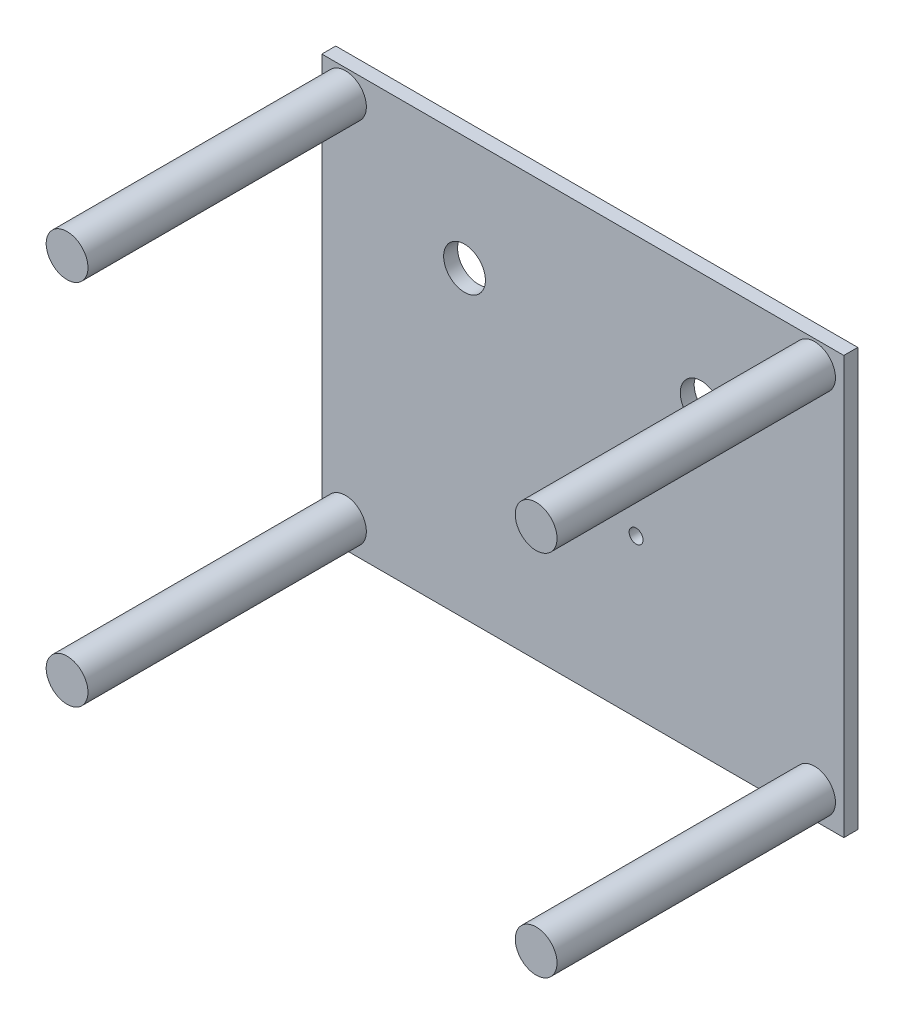
ISO-10303-21;
HEADER;
FILE_DESCRIPTION(('STEP AP214'),'2;1');
FILE_NAME('part.step','',(''),(''),'','','');
FILE_SCHEMA(('AUTOMOTIVE_DESIGN { 1 0 10303 214 1 1 1 1 }'));
ENDSEC;
DATA;
#1=APPLICATION_CONTEXT('core data for automotive mechanical design processes');
#2=APPLICATION_PROTOCOL_DEFINITION('international standard','automotive_design',2000,#1);
#3=PRODUCT_CONTEXT('',#1,'mechanical');
#4=PRODUCT('Part','Part','',(#3));
#5=PRODUCT_RELATED_PRODUCT_CATEGORY('part','',(#4));
#6=PRODUCT_DEFINITION_FORMATION('','',#4);
#7=PRODUCT_DEFINITION_CONTEXT('part definition',#1,'design');
#8=PRODUCT_DEFINITION('design','',#6,#7);
#9=PRODUCT_DEFINITION_SHAPE('','',#8);
#10=(LENGTH_UNIT() NAMED_UNIT(*) SI_UNIT(.MILLI.,.METRE.));
#11=(NAMED_UNIT(*) PLANE_ANGLE_UNIT() SI_UNIT($,.RADIAN.));
#12=(NAMED_UNIT(*) SI_UNIT($,.STERADIAN.) SOLID_ANGLE_UNIT());
#13=UNCERTAINTY_MEASURE_WITH_UNIT(LENGTH_MEASURE(1.E-05),#10,'distance_accuracy_value','');
#14=(GEOMETRIC_REPRESENTATION_CONTEXT(3) GLOBAL_UNCERTAINTY_ASSIGNED_CONTEXT((#13)) GLOBAL_UNIT_ASSIGNED_CONTEXT((#10,
#11,#12)) REPRESENTATION_CONTEXT('',''));
#15=CARTESIAN_POINT('',(0.,0.,0.));
#16=DIRECTION('',(0.,0.,1.));
#17=DIRECTION('',(1.,0.,0.));
#18=AXIS2_PLACEMENT_3D('',#15,#16,#17);
#19=CARTESIAN_POINT('',(0.,0.,2.));
#20=DIRECTION('',(0.,0.,1.));
#21=DIRECTION('',(1.,0.,0.));
#22=AXIS2_PLACEMENT_3D('',#19,#20,#21);
#23=PLANE('',#22);
#24=CARTESIAN_POINT('',(33.2922762594652,-26.2131166660187,2.));
#25=DIRECTION('',(0.,0.,1.));
#26=DIRECTION('',(1.,0.,0.));
#27=AXIS2_PLACEMENT_3D('',#24,#25,#26);
#28=CIRCLE('',#27,3.);
#29=CARTESIAN_POINT('',(36.2922762594652,-26.2131166660187,2.));
#30=VERTEX_POINT('',#29);
#31=EDGE_CURVE('E139',#30,#30,#28,.T.);
#32=ORIENTED_EDGE('',*,*,#31,.F.);
#33=EDGE_LOOP('',(#32));
#34=FACE_BOUND('',#33,.T.);
#35=CARTESIAN_POINT('',(-34.1013230701448,26.6176400713585,2.));
#36=DIRECTION('',(0.,0.,1.));
#37=DIRECTION('',(1.,0.,0.));
#38=AXIS2_PLACEMENT_3D('',#35,#36,#37);
#39=CIRCLE('',#38,3.);
#40=CARTESIAN_POINT('',(-31.1013230701448,26.6176400713585,2.));
#41=VERTEX_POINT('',#40);
#42=EDGE_CURVE('E127',#41,#41,#39,.T.);
#43=ORIENTED_EDGE('',*,*,#42,.F.);
#44=EDGE_LOOP('',(#43));
#45=FACE_BOUND('',#44,.T.);
#46=CARTESIAN_POINT('',(-17.,13.6,2.));
#47=DIRECTION('',(0.,0.,1.));
#48=DIRECTION('',(1.,0.,0.));
#49=AXIS2_PLACEMENT_3D('',#46,#47,#48);
#50=CIRCLE('',#49,3.);
#51=CARTESIAN_POINT('',(-14.,13.6,2.));
#52=VERTEX_POINT('',#51);
#53=EDGE_CURVE('E118',#52,#52,#50,.T.);
#54=ORIENTED_EDGE('',*,*,#53,.F.);
#55=EDGE_LOOP('',(#54));
#56=FACE_BOUND('',#55,.T.);
#57=CARTESIAN_POINT('',(17.,13.6,2.));
#58=DIRECTION('',(0.,0.,1.));
#59=DIRECTION('',(1.,0.,0.));
#60=AXIS2_PLACEMENT_3D('',#57,#58,#59);
#61=CIRCLE('',#60,3.);
#62=CARTESIAN_POINT('',(20.,13.6,2.));
#63=VERTEX_POINT('',#62);
#64=EDGE_CURVE('E112',#63,#63,#61,.T.);
#65=ORIENTED_EDGE('',*,*,#64,.F.);
#66=EDGE_LOOP('',(#65));
#67=FACE_BOUND('',#66,.T.);
#68=CARTESIAN_POINT('',(7.64921894064177,-7.4,2.));
#69=DIRECTION('',(0.,0.,1.));
#70=DIRECTION('',(1.,0.,0.));
#71=AXIS2_PLACEMENT_3D('',#68,#69,#70);
#72=CIRCLE('',#71,1.);
#73=CARTESIAN_POINT('',(8.64921894064177,-7.4,2.));
#74=VERTEX_POINT('',#73);
#75=EDGE_CURVE('E109',#74,#74,#72,.T.);
#76=ORIENTED_EDGE('',*,*,#75,.F.);
#77=EDGE_LOOP('',(#76));
#78=FACE_BOUND('',#77,.T.);
#79=DIRECTION('',(1.,0.,0.));
#80=VECTOR('',#79,1.);
#81=CARTESIAN_POINT('',(-37.5,-30.,2.));
#82=LINE('',#81,#80);
#83=CARTESIAN_POINT('',(-37.5,-30.,2.));
#84=VERTEX_POINT('',#83);
#85=CARTESIAN_POINT('',(37.5,-30.,2.));
#86=VERTEX_POINT('',#85);
#87=EDGE_CURVE('E83',#84,#86,#82,.T.);
#88=ORIENTED_EDGE('',*,*,#87,.T.);
#89=DIRECTION('',(0.,1.,0.));
#90=VECTOR('',#89,1.);
#91=CARTESIAN_POINT('',(37.5,-30.,2.));
#92=LINE('',#91,#90);
#93=CARTESIAN_POINT('',(37.5,30.,2.));
#94=VERTEX_POINT('',#93);
#95=EDGE_CURVE('E75',#86,#94,#92,.T.);
#96=ORIENTED_EDGE('',*,*,#95,.T.);
#97=DIRECTION('',(1.,0.,0.));
#98=VECTOR('',#97,1.);
#99=CARTESIAN_POINT('',(-37.5,30.,2.));
#100=LINE('',#99,#98);
#101=CARTESIAN_POINT('',(-37.5,30.,2.));
#102=VERTEX_POINT('',#101);
#103=EDGE_CURVE('E82',#102,#94,#100,.T.);
#104=ORIENTED_EDGE('',*,*,#103,.F.);
#105=DIRECTION('',(0.,1.,0.));
#106=VECTOR('',#105,1.);
#107=CARTESIAN_POINT('',(-37.5,-30.,2.));
#108=LINE('',#107,#106);
#109=EDGE_CURVE('E92',#84,#102,#108,.T.);
#110=ORIENTED_EDGE('',*,*,#109,.F.);
#111=EDGE_LOOP('',(#88,#96,#104,#110));
#112=FACE_BOUND('',#111,.T.);
#113=CARTESIAN_POINT('',(33.2922762594652,26.6176400713585,2.));
#114=DIRECTION('',(0.,0.,1.));
#115=DIRECTION('',(1.,0.,0.));
#116=AXIS2_PLACEMENT_3D('',#113,#114,#115);
#117=CIRCLE('',#116,3.);
#118=CARTESIAN_POINT('',(36.2922762594652,26.6176400713585,2.));
#119=VERTEX_POINT('',#118);
#120=EDGE_CURVE('E133',#119,#119,#117,.T.);
#121=ORIENTED_EDGE('',*,*,#120,.F.);
#122=EDGE_LOOP('',(#121));
#123=FACE_BOUND('',#122,.T.);
#124=CARTESIAN_POINT('',(-34.1013230701448,-26.2131166660187,2.));
#125=DIRECTION('',(0.,0.,1.));
#126=DIRECTION('',(1.,0.,0.));
#127=AXIS2_PLACEMENT_3D('',#124,#125,#126);
#128=CIRCLE('',#127,3.);
#129=CARTESIAN_POINT('',(-31.1013230701448,-26.2131166660187,2.));
#130=VERTEX_POINT('',#129);
#131=EDGE_CURVE('E145',#130,#130,#128,.T.);
#132=ORIENTED_EDGE('',*,*,#131,.F.);
#133=EDGE_LOOP('',(#132));
#134=FACE_BOUND('',#133,.T.);
#135=ADVANCED_FACE('F33',(#34,#45,#56,#67,#78,#112,#123,#134),#23,.T.);
#136=CARTESIAN_POINT('',(-37.5,-30.,2.));
#137=DIRECTION('',(0.,1.,0.));
#138=DIRECTION('',(0.,0.,1.));
#139=AXIS2_PLACEMENT_3D('',#136,#137,#138);
#140=PLANE('',#139);
#141=DIRECTION('',(1.,0.,0.));
#142=VECTOR('',#141,1.);
#143=CARTESIAN_POINT('',(-37.5,-30.,0.));
#144=LINE('',#143,#142);
#145=CARTESIAN_POINT('',(-37.5,-30.,0.));
#146=VERTEX_POINT('',#145);
#147=CARTESIAN_POINT('',(37.5,-30.,0.));
#148=VERTEX_POINT('',#147);
#149=EDGE_CURVE('E97',#146,#148,#144,.T.);
#150=ORIENTED_EDGE('',*,*,#149,.T.);
#151=DIRECTION('',(0.,0.,-1.));
#152=VECTOR('',#151,1.);
#153=CARTESIAN_POINT('',(37.5,-30.,2.));
#154=LINE('',#153,#152);
#155=EDGE_CURVE('E11',#86,#148,#154,.T.);
#156=ORIENTED_EDGE('',*,*,#155,.F.);
#157=ORIENTED_EDGE('',*,*,#87,.F.);
#158=DIRECTION('',(0.,0.,-1.));
#159=VECTOR('',#158,1.);
#160=CARTESIAN_POINT('',(-37.5,-30.,2.));
#161=LINE('',#160,#159);
#162=EDGE_CURVE('E50',#84,#146,#161,.T.);
#163=ORIENTED_EDGE('',*,*,#162,.T.);
#164=EDGE_LOOP('',(#150,#156,#157,#163));
#165=FACE_BOUND('',#164,.T.);
#166=ADVANCED_FACE('F35',(#165),#140,.F.);
#167=CARTESIAN_POINT('',(37.5,-30.,2.));
#168=DIRECTION('',(-1.,0.,0.));
#169=DIRECTION('',(0.,0.,1.));
#170=AXIS2_PLACEMENT_3D('',#167,#168,#169);
#171=PLANE('',#170);
#172=DIRECTION('',(0.,1.,0.));
#173=VECTOR('',#172,1.);
#174=CARTESIAN_POINT('',(37.5,-30.,0.));
#175=LINE('',#174,#173);
#176=CARTESIAN_POINT('',(37.5,30.,0.));
#177=VERTEX_POINT('',#176);
#178=EDGE_CURVE('E88',#148,#177,#175,.T.);
#179=ORIENTED_EDGE('',*,*,#178,.T.);
#180=DIRECTION('',(0.,0.,-1.));
#181=VECTOR('',#180,1.);
#182=CARTESIAN_POINT('',(37.5,30.,2.));
#183=LINE('',#182,#181);
#184=EDGE_CURVE('E42',#94,#177,#183,.T.);
#185=ORIENTED_EDGE('',*,*,#184,.F.);
#186=ORIENTED_EDGE('',*,*,#95,.F.);
#187=ORIENTED_EDGE('',*,*,#155,.T.);
#188=EDGE_LOOP('',(#179,#185,#186,#187));
#189=FACE_BOUND('',#188,.T.);
#190=ADVANCED_FACE('F87',(#189),#171,.F.);
#191=CARTESIAN_POINT('',(-37.5,30.,2.));
#192=DIRECTION('',(0.,1.,0.));
#193=DIRECTION('',(0.,0.,1.));
#194=AXIS2_PLACEMENT_3D('',#191,#192,#193);
#195=PLANE('',#194);
#196=DIRECTION('',(1.,0.,0.));
#197=VECTOR('',#196,1.);
#198=CARTESIAN_POINT('',(-37.5,30.,0.));
#199=LINE('',#198,#197);
#200=CARTESIAN_POINT('',(-37.5,30.,0.));
#201=VERTEX_POINT('',#200);
#202=EDGE_CURVE('E101',#201,#177,#199,.T.);
#203=ORIENTED_EDGE('',*,*,#202,.F.);
#204=DIRECTION('',(0.,0.,-1.));
#205=VECTOR('',#204,1.);
#206=CARTESIAN_POINT('',(-37.5,30.,2.));
#207=LINE('',#206,#205);
#208=EDGE_CURVE('E64',#102,#201,#207,.T.);
#209=ORIENTED_EDGE('',*,*,#208,.F.);
#210=ORIENTED_EDGE('',*,*,#103,.T.);
#211=ORIENTED_EDGE('',*,*,#184,.T.);
#212=EDGE_LOOP('',(#203,#209,#210,#211));
#213=FACE_BOUND('',#212,.T.);
#214=ADVANCED_FACE('F91',(#213),#195,.T.);
#215=CARTESIAN_POINT('',(-37.5,-30.,2.));
#216=DIRECTION('',(-1.,0.,0.));
#217=DIRECTION('',(0.,0.,1.));
#218=AXIS2_PLACEMENT_3D('',#215,#216,#217);
#219=PLANE('',#218);
#220=DIRECTION('',(0.,1.,0.));
#221=VECTOR('',#220,1.);
#222=CARTESIAN_POINT('',(-37.5,-30.,0.));
#223=LINE('',#222,#221);
#224=EDGE_CURVE('E103',#146,#201,#223,.T.);
#225=ORIENTED_EDGE('',*,*,#224,.F.);
#226=ORIENTED_EDGE('',*,*,#162,.F.);
#227=ORIENTED_EDGE('',*,*,#109,.T.);
#228=ORIENTED_EDGE('',*,*,#208,.T.);
#229=EDGE_LOOP('',(#225,#226,#227,#228));
#230=FACE_BOUND('',#229,.T.);
#231=ADVANCED_FACE('F177',(#230),#219,.T.);
#232=CARTESIAN_POINT('',(0.,0.,0.));
#233=DIRECTION('',(0.,0.,1.));
#234=DIRECTION('',(1.,0.,0.));
#235=AXIS2_PLACEMENT_3D('',#232,#233,#234);
#236=PLANE('',#235);
#237=CARTESIAN_POINT('',(-17.,13.6,0.));
#238=DIRECTION('',(0.,0.,1.));
#239=DIRECTION('',(1.,0.,0.));
#240=AXIS2_PLACEMENT_3D('',#237,#238,#239);
#241=CIRCLE('',#240,3.);
#242=CARTESIAN_POINT('',(-14.,13.6,0.));
#243=VERTEX_POINT('',#242);
#244=EDGE_CURVE('E121',#243,#243,#241,.T.);
#245=ORIENTED_EDGE('',*,*,#244,.T.);
#246=EDGE_LOOP('',(#245));
#247=FACE_BOUND('',#246,.T.);
#248=CARTESIAN_POINT('',(17.,13.6,0.));
#249=DIRECTION('',(0.,0.,1.));
#250=DIRECTION('',(1.,0.,0.));
#251=AXIS2_PLACEMENT_3D('',#248,#249,#250);
#252=CIRCLE('',#251,3.);
#253=CARTESIAN_POINT('',(20.,13.6,0.));
#254=VERTEX_POINT('',#253);
#255=EDGE_CURVE('E115',#254,#254,#252,.T.);
#256=ORIENTED_EDGE('',*,*,#255,.T.);
#257=EDGE_LOOP('',(#256));
#258=FACE_BOUND('',#257,.T.);
#259=CARTESIAN_POINT('',(7.64921894064177,-7.4,0.));
#260=DIRECTION('',(0.,0.,1.));
#261=DIRECTION('',(1.,0.,0.));
#262=AXIS2_PLACEMENT_3D('',#259,#260,#261);
#263=CIRCLE('',#262,1.);
#264=CARTESIAN_POINT('',(8.64921894064177,-7.4,0.));
#265=VERTEX_POINT('',#264);
#266=EDGE_CURVE('E99',#265,#265,#263,.T.);
#267=ORIENTED_EDGE('',*,*,#266,.T.);
#268=EDGE_LOOP('',(#267));
#269=FACE_BOUND('',#268,.T.);
#270=ORIENTED_EDGE('',*,*,#149,.F.);
#271=ORIENTED_EDGE('',*,*,#224,.T.);
#272=ORIENTED_EDGE('',*,*,#202,.T.);
#273=ORIENTED_EDGE('',*,*,#178,.F.);
#274=EDGE_LOOP('',(#270,#271,#272,#273));
#275=FACE_BOUND('',#274,.T.);
#276=ADVANCED_FACE('F174',(#247,#258,#269,#275),#236,.F.);
#277=CARTESIAN_POINT('',(7.64921894064177,-7.4,0.));
#278=DIRECTION('',(0.,0.,1.));
#279=DIRECTION('',(1.,0.,0.));
#280=AXIS2_PLACEMENT_3D('',#277,#278,#279);
#281=CYLINDRICAL_SURFACE('',#280,1.);
#282=ORIENTED_EDGE('',*,*,#266,.F.);
#283=EDGE_LOOP('',(#282));
#284=FACE_BOUND('',#283,.T.);
#285=ORIENTED_EDGE('',*,*,#75,.T.);
#286=EDGE_LOOP('',(#285));
#287=FACE_BOUND('',#286,.T.);
#288=ADVANCED_FACE('F172',(#284,#287),#281,.F.);
#289=CARTESIAN_POINT('',(17.,13.6,0.));
#290=DIRECTION('',(0.,0.,1.));
#291=DIRECTION('',(1.,0.,0.));
#292=AXIS2_PLACEMENT_3D('',#289,#290,#291);
#293=CYLINDRICAL_SURFACE('',#292,3.);
#294=ORIENTED_EDGE('',*,*,#255,.F.);
#295=EDGE_LOOP('',(#294));
#296=FACE_BOUND('',#295,.T.);
#297=ORIENTED_EDGE('',*,*,#64,.T.);
#298=EDGE_LOOP('',(#297));
#299=FACE_BOUND('',#298,.T.);
#300=ADVANCED_FACE('F205',(#296,#299),#293,.F.);
#301=CARTESIAN_POINT('',(-17.,13.6,0.));
#302=DIRECTION('',(0.,0.,1.));
#303=DIRECTION('',(1.,0.,0.));
#304=AXIS2_PLACEMENT_3D('',#301,#302,#303);
#305=CYLINDRICAL_SURFACE('',#304,3.);
#306=ORIENTED_EDGE('',*,*,#244,.F.);
#307=EDGE_LOOP('',(#306));
#308=FACE_BOUND('',#307,.T.);
#309=ORIENTED_EDGE('',*,*,#53,.T.);
#310=EDGE_LOOP('',(#309));
#311=FACE_BOUND('',#310,.T.);
#312=ADVANCED_FACE('F212',(#308,#311),#305,.F.);
#313=CARTESIAN_POINT('',(-34.1013230701448,26.6176400713585,42.));
#314=DIRECTION('',(0.,0.,-1.));
#315=DIRECTION('',(-1.,0.,0.));
#316=AXIS2_PLACEMENT_3D('',#313,#314,#315);
#317=CYLINDRICAL_SURFACE('',#316,3.);
#318=CARTESIAN_POINT('',(-34.1013230701448,26.6176400713585,42.));
#319=DIRECTION('',(0.,0.,1.));
#320=DIRECTION('',(1.,0.,0.));
#321=AXIS2_PLACEMENT_3D('',#318,#319,#320);
#322=CIRCLE('',#321,3.);
#323=CARTESIAN_POINT('',(-31.1013230701448,26.6176400713585,42.));
#324=VERTEX_POINT('',#323);
#325=EDGE_CURVE('E124',#324,#324,#322,.T.);
#326=ORIENTED_EDGE('',*,*,#325,.F.);
#327=EDGE_LOOP('',(#326));
#328=FACE_BOUND('',#327,.T.);
#329=ORIENTED_EDGE('',*,*,#42,.T.);
#330=EDGE_LOOP('',(#329));
#331=FACE_BOUND('',#330,.T.);
#332=ADVANCED_FACE('F217',(#328,#331),#317,.T.);
#333=CARTESIAN_POINT('',(-34.1013230701448,26.6176400713585,42.));
#334=DIRECTION('',(0.,0.,1.));
#335=DIRECTION('',(1.,0.,0.));
#336=AXIS2_PLACEMENT_3D('',#333,#334,#335);
#337=PLANE('',#336);
#338=ORIENTED_EDGE('',*,*,#325,.T.);
#339=EDGE_LOOP('',(#338));
#340=FACE_BOUND('',#339,.T.);
#341=ADVANCED_FACE('F230',(#340),#337,.T.);
#342=CARTESIAN_POINT('',(33.2922762594652,26.6176400713585,42.));
#343=DIRECTION('',(0.,0.,-1.));
#344=DIRECTION('',(-1.,0.,0.));
#345=AXIS2_PLACEMENT_3D('',#342,#343,#344);
#346=CYLINDRICAL_SURFACE('',#345,3.);
#347=CARTESIAN_POINT('',(33.2922762594652,26.6176400713585,42.));
#348=DIRECTION('',(0.,0.,1.));
#349=DIRECTION('',(1.,0.,0.));
#350=AXIS2_PLACEMENT_3D('',#347,#348,#349);
#351=CIRCLE('',#350,3.);
#352=CARTESIAN_POINT('',(36.2922762594652,26.6176400713585,42.));
#353=VERTEX_POINT('',#352);
#354=EDGE_CURVE('E130',#353,#353,#351,.T.);
#355=ORIENTED_EDGE('',*,*,#354,.F.);
#356=EDGE_LOOP('',(#355));
#357=FACE_BOUND('',#356,.T.);
#358=ORIENTED_EDGE('',*,*,#120,.T.);
#359=EDGE_LOOP('',(#358));
#360=FACE_BOUND('',#359,.T.);
#361=ADVANCED_FACE('F237',(#357,#360),#346,.T.);
#362=CARTESIAN_POINT('',(33.2922762594652,26.6176400713585,42.));
#363=DIRECTION('',(0.,0.,1.));
#364=DIRECTION('',(1.,0.,0.));
#365=AXIS2_PLACEMENT_3D('',#362,#363,#364);
#366=PLANE('',#365);
#367=ORIENTED_EDGE('',*,*,#354,.T.);
#368=EDGE_LOOP('',(#367));
#369=FACE_BOUND('',#368,.T.);
#370=ADVANCED_FACE('F245',(#369),#366,.T.);
#371=CARTESIAN_POINT('',(33.2922762594652,-26.2131166660187,42.));
#372=DIRECTION('',(0.,0.,-1.));
#373=DIRECTION('',(-1.,0.,0.));
#374=AXIS2_PLACEMENT_3D('',#371,#372,#373);
#375=CYLINDRICAL_SURFACE('',#374,3.);
#376=CARTESIAN_POINT('',(33.2922762594652,-26.2131166660187,42.));
#377=DIRECTION('',(0.,0.,1.));
#378=DIRECTION('',(1.,0.,0.));
#379=AXIS2_PLACEMENT_3D('',#376,#377,#378);
#380=CIRCLE('',#379,3.);
#381=CARTESIAN_POINT('',(36.2922762594652,-26.2131166660187,42.));
#382=VERTEX_POINT('',#381);
#383=EDGE_CURVE('E136',#382,#382,#380,.T.);
#384=ORIENTED_EDGE('',*,*,#383,.F.);
#385=EDGE_LOOP('',(#384));
#386=FACE_BOUND('',#385,.T.);
#387=ORIENTED_EDGE('',*,*,#31,.T.);
#388=EDGE_LOOP('',(#387));
#389=FACE_BOUND('',#388,.T.);
#390=ADVANCED_FACE('F253',(#386,#389),#375,.T.);
#391=CARTESIAN_POINT('',(33.2922762594652,-26.2131166660187,42.));
#392=DIRECTION('',(0.,0.,1.));
#393=DIRECTION('',(1.,0.,0.));
#394=AXIS2_PLACEMENT_3D('',#391,#392,#393);
#395=PLANE('',#394);
#396=ORIENTED_EDGE('',*,*,#383,.T.);
#397=EDGE_LOOP('',(#396));
#398=FACE_BOUND('',#397,.T.);
#399=ADVANCED_FACE('F156',(#398),#395,.T.);
#400=CARTESIAN_POINT('',(-34.1013230701448,-26.2131166660187,42.));
#401=DIRECTION('',(0.,0.,-1.));
#402=DIRECTION('',(-1.,0.,0.));
#403=AXIS2_PLACEMENT_3D('',#400,#401,#402);
#404=CYLINDRICAL_SURFACE('',#403,3.);
#405=CARTESIAN_POINT('',(-34.1013230701448,-26.2131166660187,42.));
#406=DIRECTION('',(0.,0.,1.));
#407=DIRECTION('',(1.,0.,0.));
#408=AXIS2_PLACEMENT_3D('',#405,#406,#407);
#409=CIRCLE('',#408,3.);
#410=CARTESIAN_POINT('',(-31.1013230701448,-26.2131166660187,42.));
#411=VERTEX_POINT('',#410);
#412=EDGE_CURVE('E142',#411,#411,#409,.T.);
#413=ORIENTED_EDGE('',*,*,#412,.F.);
#414=EDGE_LOOP('',(#413));
#415=FACE_BOUND('',#414,.T.);
#416=ORIENTED_EDGE('',*,*,#131,.T.);
#417=EDGE_LOOP('',(#416));
#418=FACE_BOUND('',#417,.T.);
#419=ADVANCED_FACE('F153',(#415,#418),#404,.T.);
#420=CARTESIAN_POINT('',(-34.1013230701448,-26.2131166660187,42.));
#421=DIRECTION('',(0.,0.,1.));
#422=DIRECTION('',(1.,0.,0.));
#423=AXIS2_PLACEMENT_3D('',#420,#421,#422);
#424=PLANE('',#423);
#425=ORIENTED_EDGE('',*,*,#412,.T.);
#426=EDGE_LOOP('',(#425));
#427=FACE_BOUND('',#426,.T.);
#428=ADVANCED_FACE('F151',(#427),#424,.T.);
#429=CLOSED_SHELL('',(#135,#166,#190,#214,#231,#276,#288,#300,#312,#332,#341,#361,#370,#390,
#399,#419,#428));
#430=MANIFOLD_SOLID_BREP('B2',#429);
#431=ADVANCED_BREP_SHAPE_REPRESENTATION('',(#18,#430),#14);
#432=SHAPE_DEFINITION_REPRESENTATION(#9,#431);
ENDSEC;
END-ISO-10303-21;
